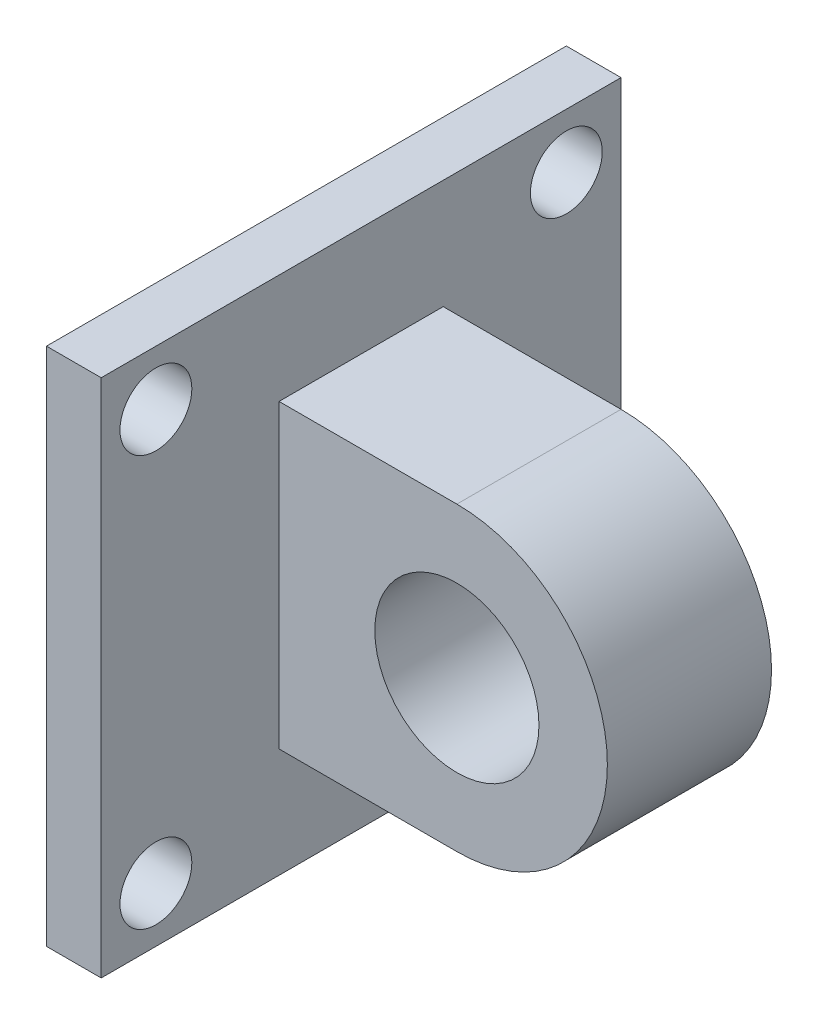
ISO-10303-21;
HEADER;
FILE_DESCRIPTION(('STEP AP214'),'2;1');
FILE_NAME('part.step','',(''),(''),'','','');
FILE_SCHEMA(('AUTOMOTIVE_DESIGN { 1 0 10303 214 1 1 1 1 }'));
ENDSEC;
DATA;
#1=APPLICATION_CONTEXT('core data for automotive mechanical design processes');
#2=APPLICATION_PROTOCOL_DEFINITION('international standard','automotive_design',2000,#1);
#3=PRODUCT_CONTEXT('',#1,'mechanical');
#4=PRODUCT('Part','Part','',(#3));
#5=PRODUCT_RELATED_PRODUCT_CATEGORY('part','',(#4));
#6=PRODUCT_DEFINITION_FORMATION('','',#4);
#7=PRODUCT_DEFINITION_CONTEXT('part definition',#1,'design');
#8=PRODUCT_DEFINITION('design','',#6,#7);
#9=PRODUCT_DEFINITION_SHAPE('','',#8);
#10=(LENGTH_UNIT() NAMED_UNIT(*) SI_UNIT(.MILLI.,.METRE.));
#11=(NAMED_UNIT(*) PLANE_ANGLE_UNIT() SI_UNIT($,.RADIAN.));
#12=(NAMED_UNIT(*) SI_UNIT($,.STERADIAN.) SOLID_ANGLE_UNIT());
#13=UNCERTAINTY_MEASURE_WITH_UNIT(LENGTH_MEASURE(1.E-05),#10,'distance_accuracy_value','');
#14=(GEOMETRIC_REPRESENTATION_CONTEXT(3) GLOBAL_UNCERTAINTY_ASSIGNED_CONTEXT((#13)) GLOBAL_UNIT_ASSIGNED_CONTEXT((#10,
#11,#12)) REPRESENTATION_CONTEXT('',''));
#15=CARTESIAN_POINT('',(0.,0.,0.));
#16=DIRECTION('',(0.,0.,1.));
#17=DIRECTION('',(1.,0.,0.));
#18=AXIS2_PLACEMENT_3D('',#15,#16,#17);
#19=CARTESIAN_POINT('',(25.4,0.,0.));
#20=DIRECTION('',(1.,0.,0.));
#21=DIRECTION('',(0.,0.,-1.));
#22=AXIS2_PLACEMENT_3D('',#19,#20,#21);
#23=PLANE('',#22);
#24=CARTESIAN_POINT('',(25.4,-95.25,-95.25));
#25=DIRECTION('',(1.,0.,0.));
#26=DIRECTION('',(0.,0.,-1.));
#27=AXIS2_PLACEMENT_3D('',#24,#25,#26);
#28=CIRCLE('',#27,16.6751);
#29=CARTESIAN_POINT('',(25.4,-95.25,-111.9251));
#30=VERTEX_POINT('',#29);
#31=EDGE_CURVE('E251',#30,#30,#28,.T.);
#32=ORIENTED_EDGE('',*,*,#31,.F.);
#33=EDGE_LOOP('',(#32));
#34=FACE_BOUND('',#33,.T.);
#35=CARTESIAN_POINT('',(25.4,95.25,-95.25));
#36=DIRECTION('',(1.,0.,0.));
#37=DIRECTION('',(0.,0.,-1.));
#38=AXIS2_PLACEMENT_3D('',#35,#36,#37);
#39=CIRCLE('',#38,16.6751);
#40=CARTESIAN_POINT('',(25.4,95.25,-111.9251));
#41=VERTEX_POINT('',#40);
#42=EDGE_CURVE('E45',#41,#41,#39,.T.);
#43=ORIENTED_EDGE('',*,*,#42,.F.);
#44=EDGE_LOOP('',(#43));
#45=FACE_BOUND('',#44,.T.);
#46=CARTESIAN_POINT('',(25.4,-95.25,95.25));
#47=DIRECTION('',(1.,0.,0.));
#48=DIRECTION('',(0.,0.,-1.));
#49=AXIS2_PLACEMENT_3D('',#46,#47,#48);
#50=CIRCLE('',#49,16.6751);
#51=CARTESIAN_POINT('',(25.4,-95.25,78.5749));
#52=VERTEX_POINT('',#51);
#53=EDGE_CURVE('E180',#52,#52,#50,.T.);
#54=ORIENTED_EDGE('',*,*,#53,.F.);
#55=EDGE_LOOP('',(#54));
#56=FACE_BOUND('',#55,.T.);
#57=CARTESIAN_POINT('',(25.4,95.25,95.25));
#58=DIRECTION('',(1.,0.,0.));
#59=DIRECTION('',(0.,0.,-1.));
#60=AXIS2_PLACEMENT_3D('',#57,#58,#59);
#61=CIRCLE('',#60,16.6751);
#62=CARTESIAN_POINT('',(25.4,95.25,78.5749));
#63=VERTEX_POINT('',#62);
#64=EDGE_CURVE('E171',#63,#63,#61,.T.);
#65=ORIENTED_EDGE('',*,*,#64,.F.);
#66=EDGE_LOOP('',(#65));
#67=FACE_BOUND('',#66,.T.);
#68=DIRECTION('',(0.,0.,1.));
#69=VECTOR('',#68,1.);
#70=CARTESIAN_POINT('',(25.4,120.65,-120.65));
#71=LINE('',#70,#69);
#72=CARTESIAN_POINT('',(25.4,120.65,-120.65));
#73=VERTEX_POINT('',#72);
#74=CARTESIAN_POINT('',(25.4,120.65,120.65));
#75=VERTEX_POINT('',#74);
#76=EDGE_CURVE('E141',#73,#75,#71,.T.);
#77=ORIENTED_EDGE('',*,*,#76,.T.);
#78=DIRECTION('',(0.,-1.,0.));
#79=VECTOR('',#78,1.);
#80=CARTESIAN_POINT('',(25.4,120.65,120.65));
#81=LINE('',#80,#79);
#82=CARTESIAN_POINT('',(25.4,-120.65,120.65));
#83=VERTEX_POINT('',#82);
#84=EDGE_CURVE('E160',#75,#83,#81,.T.);
#85=ORIENTED_EDGE('',*,*,#84,.T.);
#86=DIRECTION('',(0.,0.,-1.));
#87=VECTOR('',#86,1.);
#88=CARTESIAN_POINT('',(25.4,-120.65,120.65));
#89=LINE('',#88,#87);
#90=CARTESIAN_POINT('',(25.4,-120.65,-120.65));
#91=VERTEX_POINT('',#90);
#92=EDGE_CURVE('E163',#83,#91,#89,.T.);
#93=ORIENTED_EDGE('',*,*,#92,.T.);
#94=DIRECTION('',(0.,1.,0.));
#95=VECTOR('',#94,1.);
#96=CARTESIAN_POINT('',(25.4,-120.65,-120.65));
#97=LINE('',#96,#95);
#98=EDGE_CURVE('E148',#91,#73,#97,.T.);
#99=ORIENTED_EDGE('',*,*,#98,.T.);
#100=EDGE_LOOP('',(#77,#85,#93,#99));
#101=FACE_BOUND('',#100,.T.);
#102=DIRECTION('',(0.,0.,1.));
#103=VECTOR('',#102,1.);
#104=CARTESIAN_POINT('',(25.4,69.85,-38.1));
#105=LINE('',#104,#103);
#106=CARTESIAN_POINT('',(25.4,69.85,-38.1));
#107=VERTEX_POINT('',#106);
#108=CARTESIAN_POINT('',(25.4,69.85,38.1));
#109=VERTEX_POINT('',#108);
#110=EDGE_CURVE('E58',#107,#109,#105,.T.);
#111=ORIENTED_EDGE('',*,*,#110,.F.);
#112=DIRECTION('',(0.,-1.,0.));
#113=VECTOR('',#112,1.);
#114=CARTESIAN_POINT('',(25.4,69.85,-38.1));
#115=LINE('',#114,#113);
#116=CARTESIAN_POINT('',(25.4,-69.85,-38.1));
#117=VERTEX_POINT('',#116);
#118=EDGE_CURVE('E62',#107,#117,#115,.T.);
#119=ORIENTED_EDGE('',*,*,#118,.T.);
#120=DIRECTION('',(0.,0.,1.));
#121=VECTOR('',#120,1.);
#122=CARTESIAN_POINT('',(25.4,-69.85,-38.1));
#123=LINE('',#122,#121);
#124=CARTESIAN_POINT('',(25.4,-69.85,38.1));
#125=VERTEX_POINT('',#124);
#126=EDGE_CURVE('E116',#117,#125,#123,.T.);
#127=ORIENTED_EDGE('',*,*,#126,.T.);
#128=DIRECTION('',(0.,-1.,0.));
#129=VECTOR('',#128,1.);
#130=CARTESIAN_POINT('',(25.4,69.85,38.1));
#131=LINE('',#130,#129);
#132=EDGE_CURVE('E134',#109,#125,#131,.T.);
#133=ORIENTED_EDGE('',*,*,#132,.F.);
#134=EDGE_LOOP('',(#111,#119,#127,#133));
#135=FACE_BOUND('',#134,.T.);
#136=ADVANCED_FACE('F41',(#34,#45,#56,#67,#101,#135),#23,.T.);
#137=CARTESIAN_POINT('',(0.,120.65,-120.65));
#138=DIRECTION('',(0.,1.,0.));
#139=DIRECTION('',(0.,0.,1.));
#140=AXIS2_PLACEMENT_3D('',#137,#138,#139);
#141=PLANE('',#140);
#142=ORIENTED_EDGE('',*,*,#76,.F.);
#143=DIRECTION('',(1.,0.,0.));
#144=VECTOR('',#143,1.);
#145=CARTESIAN_POINT('',(0.,120.65,-120.65));
#146=LINE('',#145,#144);
#147=CARTESIAN_POINT('',(0.,120.65,-120.65));
#148=VERTEX_POINT('',#147);
#149=EDGE_CURVE('E11',#148,#73,#146,.T.);
#150=ORIENTED_EDGE('',*,*,#149,.F.);
#151=DIRECTION('',(0.,0.,1.));
#152=VECTOR('',#151,1.);
#153=CARTESIAN_POINT('',(0.,120.65,-120.65));
#154=LINE('',#153,#152);
#155=CARTESIAN_POINT('',(0.,120.65,120.65));
#156=VERTEX_POINT('',#155);
#157=EDGE_CURVE('E144',#148,#156,#154,.T.);
#158=ORIENTED_EDGE('',*,*,#157,.T.);
#159=DIRECTION('',(1.,0.,0.));
#160=VECTOR('',#159,1.);
#161=CARTESIAN_POINT('',(0.,120.65,120.65));
#162=LINE('',#161,#160);
#163=EDGE_CURVE('E157',#156,#75,#162,.T.);
#164=ORIENTED_EDGE('',*,*,#163,.T.);
#165=EDGE_LOOP('',(#142,#150,#158,#164));
#166=FACE_BOUND('',#165,.T.);
#167=ADVANCED_FACE('F43',(#166),#141,.T.);
#168=CARTESIAN_POINT('',(0.,-120.65,-120.65));
#169=DIRECTION('',(0.,0.,-1.));
#170=DIRECTION('',(-1.,0.,0.));
#171=AXIS2_PLACEMENT_3D('',#168,#169,#170);
#172=PLANE('',#171);
#173=ORIENTED_EDGE('',*,*,#98,.F.);
#174=DIRECTION('',(1.,0.,0.));
#175=VECTOR('',#174,1.);
#176=CARTESIAN_POINT('',(0.,-120.65,-120.65));
#177=LINE('',#176,#175);
#178=CARTESIAN_POINT('',(0.,-120.65,-120.65));
#179=VERTEX_POINT('',#178);
#180=EDGE_CURVE('E50',#179,#91,#177,.T.);
#181=ORIENTED_EDGE('',*,*,#180,.F.);
#182=DIRECTION('',(0.,1.,0.));
#183=VECTOR('',#182,1.);
#184=CARTESIAN_POINT('',(0.,-120.65,-120.65));
#185=LINE('',#184,#183);
#186=EDGE_CURVE('E154',#179,#148,#185,.T.);
#187=ORIENTED_EDGE('',*,*,#186,.T.);
#188=ORIENTED_EDGE('',*,*,#149,.T.);
#189=EDGE_LOOP('',(#173,#181,#187,#188));
#190=FACE_BOUND('',#189,.T.);
#191=ADVANCED_FACE('F202',(#190),#172,.T.);
#192=CARTESIAN_POINT('',(0.,-120.65,120.65));
#193=DIRECTION('',(0.,-1.,0.));
#194=DIRECTION('',(0.,0.,-1.));
#195=AXIS2_PLACEMENT_3D('',#192,#193,#194);
#196=PLANE('',#195);
#197=ORIENTED_EDGE('',*,*,#92,.F.);
#198=DIRECTION('',(1.,0.,0.));
#199=VECTOR('',#198,1.);
#200=CARTESIAN_POINT('',(0.,-120.65,120.65));
#201=LINE('',#200,#199);
#202=CARTESIAN_POINT('',(0.,-120.65,120.65));
#203=VERTEX_POINT('',#202);
#204=EDGE_CURVE('E169',#203,#83,#201,.T.);
#205=ORIENTED_EDGE('',*,*,#204,.F.);
#206=DIRECTION('',(0.,0.,-1.));
#207=VECTOR('',#206,1.);
#208=CARTESIAN_POINT('',(0.,-120.65,120.65));
#209=LINE('',#208,#207);
#210=EDGE_CURVE('E151',#203,#179,#209,.T.);
#211=ORIENTED_EDGE('',*,*,#210,.T.);
#212=ORIENTED_EDGE('',*,*,#180,.T.);
#213=EDGE_LOOP('',(#197,#205,#211,#212));
#214=FACE_BOUND('',#213,.T.);
#215=ADVANCED_FACE('F212',(#214),#196,.T.);
#216=CARTESIAN_POINT('',(0.,120.65,120.65));
#217=DIRECTION('',(0.,0.,1.));
#218=DIRECTION('',(1.,0.,0.));
#219=AXIS2_PLACEMENT_3D('',#216,#217,#218);
#220=PLANE('',#219);
#221=ORIENTED_EDGE('',*,*,#84,.F.);
#222=ORIENTED_EDGE('',*,*,#163,.F.);
#223=DIRECTION('',(0.,-1.,0.));
#224=VECTOR('',#223,1.);
#225=CARTESIAN_POINT('',(0.,120.65,120.65));
#226=LINE('',#225,#224);
#227=EDGE_CURVE('E147',#156,#203,#226,.T.);
#228=ORIENTED_EDGE('',*,*,#227,.T.);
#229=ORIENTED_EDGE('',*,*,#204,.T.);
#230=EDGE_LOOP('',(#221,#222,#228,#229));
#231=FACE_BOUND('',#230,.T.);
#232=ADVANCED_FACE('F215',(#231),#220,.T.);
#233=CARTESIAN_POINT('',(0.,0.,0.));
#234=DIRECTION('',(1.,0.,0.));
#235=DIRECTION('',(0.,0.,-1.));
#236=AXIS2_PLACEMENT_3D('',#233,#234,#235);
#237=PLANE('',#236);
#238=CARTESIAN_POINT('',(0.,-95.25,-95.25));
#239=DIRECTION('',(-1.,0.,0.));
#240=DIRECTION('',(0.,0.,1.));
#241=AXIS2_PLACEMENT_3D('',#238,#239,#240);
#242=CIRCLE('',#241,16.6751);
#243=CARTESIAN_POINT('',(0.,-95.25,-78.5749));
#244=VERTEX_POINT('',#243);
#245=EDGE_CURVE('E239',#244,#244,#242,.T.);
#246=ORIENTED_EDGE('',*,*,#245,.F.);
#247=EDGE_LOOP('',(#246));
#248=FACE_BOUND('',#247,.T.);
#249=CARTESIAN_POINT('',(0.,95.25,-95.25));
#250=DIRECTION('',(-1.,0.,0.));
#251=DIRECTION('',(0.,0.,1.));
#252=AXIS2_PLACEMENT_3D('',#249,#250,#251);
#253=CIRCLE('',#252,16.6751);
#254=CARTESIAN_POINT('',(0.,95.25,-78.5749));
#255=VERTEX_POINT('',#254);
#256=EDGE_CURVE('E243',#255,#255,#253,.T.);
#257=ORIENTED_EDGE('',*,*,#256,.F.);
#258=EDGE_LOOP('',(#257));
#259=FACE_BOUND('',#258,.T.);
#260=CARTESIAN_POINT('',(0.,-95.25,95.25));
#261=DIRECTION('',(-1.,0.,0.));
#262=DIRECTION('',(0.,0.,1.));
#263=AXIS2_PLACEMENT_3D('',#260,#261,#262);
#264=CIRCLE('',#263,16.6751);
#265=CARTESIAN_POINT('',(0.,-95.25,111.9251));
#266=VERTEX_POINT('',#265);
#267=EDGE_CURVE('E185',#266,#266,#264,.T.);
#268=ORIENTED_EDGE('',*,*,#267,.F.);
#269=EDGE_LOOP('',(#268));
#270=FACE_BOUND('',#269,.T.);
#271=CARTESIAN_POINT('',(0.,95.25,95.25));
#272=DIRECTION('',(-1.,0.,0.));
#273=DIRECTION('',(0.,0.,1.));
#274=AXIS2_PLACEMENT_3D('',#271,#272,#273);
#275=CIRCLE('',#274,16.6751);
#276=CARTESIAN_POINT('',(0.,95.25,111.9251));
#277=VERTEX_POINT('',#276);
#278=EDGE_CURVE('E174',#277,#277,#275,.T.);
#279=ORIENTED_EDGE('',*,*,#278,.F.);
#280=EDGE_LOOP('',(#279));
#281=FACE_BOUND('',#280,.T.);
#282=ORIENTED_EDGE('',*,*,#157,.F.);
#283=ORIENTED_EDGE('',*,*,#186,.F.);
#284=ORIENTED_EDGE('',*,*,#210,.F.);
#285=ORIENTED_EDGE('',*,*,#227,.F.);
#286=EDGE_LOOP('',(#282,#283,#284,#285));
#287=FACE_BOUND('',#286,.T.);
#288=ADVANCED_FACE('F208',(#248,#259,#270,#281,#287),#237,.F.);
#289=CARTESIAN_POINT('',(107.95,69.85,-38.1));
#290=DIRECTION('',(0.,1.,0.));
#291=DIRECTION('',(0.,0.,1.));
#292=AXIS2_PLACEMENT_3D('',#289,#290,#291);
#293=PLANE('',#292);
#294=DIRECTION('',(-1.,0.,0.));
#295=VECTOR('',#294,1.);
#296=CARTESIAN_POINT('',(107.95,69.85,38.1));
#297=LINE('',#296,#295);
#298=CARTESIAN_POINT('',(107.95,69.85,38.1));
#299=VERTEX_POINT('',#298);
#300=EDGE_CURVE('E131',#299,#109,#297,.T.);
#301=ORIENTED_EDGE('',*,*,#300,.F.);
#302=DIRECTION('',(0.,0.,1.));
#303=VECTOR('',#302,1.);
#304=CARTESIAN_POINT('',(107.95,69.85,-38.1));
#305=LINE('',#304,#303);
#306=CARTESIAN_POINT('',(107.95,69.85,-38.1));
#307=VERTEX_POINT('',#306);
#308=EDGE_CURVE('E115',#307,#299,#305,.T.);
#309=ORIENTED_EDGE('',*,*,#308,.F.);
#310=DIRECTION('',(-1.,0.,0.));
#311=VECTOR('',#310,1.);
#312=CARTESIAN_POINT('',(107.95,69.85,-38.1));
#313=LINE('',#312,#311);
#314=EDGE_CURVE('E126',#307,#107,#313,.T.);
#315=ORIENTED_EDGE('',*,*,#314,.T.);
#316=ORIENTED_EDGE('',*,*,#110,.T.);
#317=EDGE_LOOP('',(#301,#309,#315,#316));
#318=FACE_BOUND('',#317,.T.);
#319=ADVANCED_FACE('F193',(#318),#293,.T.);
#320=CARTESIAN_POINT('',(107.95,0.,-38.1));
#321=DIRECTION('',(0.,0.,1.));
#322=DIRECTION('',(1.,0.,0.));
#323=AXIS2_PLACEMENT_3D('',#320,#321,#322);
#324=CYLINDRICAL_SURFACE('',#323,69.85);
#325=CARTESIAN_POINT('',(107.95,0.,38.1));
#326=DIRECTION('',(0.,0.,1.));
#327=DIRECTION('',(1.,0.,0.));
#328=AXIS2_PLACEMENT_3D('',#325,#326,#327);
#329=CIRCLE('',#328,69.85);
#330=CARTESIAN_POINT('',(107.95,-69.85,38.1));
#331=VERTEX_POINT('',#330);
#332=EDGE_CURVE('E111',#331,#299,#329,.T.);
#333=ORIENTED_EDGE('',*,*,#332,.F.);
#334=DIRECTION('',(0.,0.,1.));
#335=VECTOR('',#334,1.);
#336=CARTESIAN_POINT('',(107.95,-69.85,-38.1));
#337=LINE('',#336,#335);
#338=CARTESIAN_POINT('',(107.95,-69.85,-38.1));
#339=VERTEX_POINT('',#338);
#340=EDGE_CURVE('E105',#339,#331,#337,.T.);
#341=ORIENTED_EDGE('',*,*,#340,.F.);
#342=CARTESIAN_POINT('',(107.95,0.,-38.1));
#343=DIRECTION('',(0.,0.,1.));
#344=DIRECTION('',(1.,0.,0.));
#345=AXIS2_PLACEMENT_3D('',#342,#343,#344);
#346=CIRCLE('',#345,69.85);
#347=EDGE_CURVE('E109',#339,#307,#346,.T.);
#348=ORIENTED_EDGE('',*,*,#347,.T.);
#349=ORIENTED_EDGE('',*,*,#308,.T.);
#350=EDGE_LOOP('',(#333,#341,#348,#349));
#351=FACE_BOUND('',#350,.T.);
#352=ADVANCED_FACE('F107',(#351),#324,.T.);
#353=CARTESIAN_POINT('',(25.4,-69.85,-38.1));
#354=DIRECTION('',(0.,-1.,0.));
#355=DIRECTION('',(0.,0.,-1.));
#356=AXIS2_PLACEMENT_3D('',#353,#354,#355);
#357=PLANE('',#356);
#358=DIRECTION('',(1.,0.,0.));
#359=VECTOR('',#358,1.);
#360=CARTESIAN_POINT('',(25.4,-69.85,38.1));
#361=LINE('',#360,#359);
#362=EDGE_CURVE('E138',#125,#331,#361,.T.);
#363=ORIENTED_EDGE('',*,*,#362,.F.);
#364=ORIENTED_EDGE('',*,*,#126,.F.);
#365=DIRECTION('',(1.,0.,0.));
#366=VECTOR('',#365,1.);
#367=CARTESIAN_POINT('',(25.4,-69.85,-38.1));
#368=LINE('',#367,#366);
#369=EDGE_CURVE('E119',#117,#339,#368,.T.);
#370=ORIENTED_EDGE('',*,*,#369,.T.);
#371=ORIENTED_EDGE('',*,*,#340,.T.);
#372=EDGE_LOOP('',(#363,#364,#370,#371));
#373=FACE_BOUND('',#372,.T.);
#374=ADVANCED_FACE('F120',(#373),#357,.T.);
#375=CARTESIAN_POINT('',(107.95,0.,-38.1));
#376=DIRECTION('',(0.,0.,1.));
#377=DIRECTION('',(1.,0.,0.));
#378=AXIS2_PLACEMENT_3D('',#375,#376,#377);
#379=PLANE('',#378);
#380=CARTESIAN_POINT('',(107.95,0.,-38.1));
#381=DIRECTION('',(0.,0.,-1.));
#382=DIRECTION('',(-1.,0.,0.));
#383=AXIS2_PLACEMENT_3D('',#380,#381,#382);
#384=CIRCLE('',#383,38.1);
#385=CARTESIAN_POINT('',(69.85,0.,-38.1));
#386=VERTEX_POINT('',#385);
#387=EDGE_CURVE('E173',#386,#386,#384,.T.);
#388=ORIENTED_EDGE('',*,*,#387,.F.);
#389=EDGE_LOOP('',(#388));
#390=FACE_BOUND('',#389,.T.);
#391=ORIENTED_EDGE('',*,*,#314,.F.);
#392=ORIENTED_EDGE('',*,*,#347,.F.);
#393=ORIENTED_EDGE('',*,*,#369,.F.);
#394=ORIENTED_EDGE('',*,*,#118,.F.);
#395=EDGE_LOOP('',(#391,#392,#393,#394));
#396=FACE_BOUND('',#395,.T.);
#397=ADVANCED_FACE('F124',(#390,#396),#379,.F.);
#398=CARTESIAN_POINT('',(107.95,0.,38.1));
#399=DIRECTION('',(0.,0.,1.));
#400=DIRECTION('',(1.,0.,0.));
#401=AXIS2_PLACEMENT_3D('',#398,#399,#400);
#402=PLANE('',#401);
#403=CARTESIAN_POINT('',(107.95,0.,38.1));
#404=DIRECTION('',(0.,0.,1.));
#405=DIRECTION('',(1.,0.,0.));
#406=AXIS2_PLACEMENT_3D('',#403,#404,#405);
#407=CIRCLE('',#406,38.1);
#408=CARTESIAN_POINT('',(146.05,0.,38.1));
#409=VERTEX_POINT('',#408);
#410=EDGE_CURVE('E135',#409,#409,#407,.T.);
#411=ORIENTED_EDGE('',*,*,#410,.F.);
#412=EDGE_LOOP('',(#411));
#413=FACE_BOUND('',#412,.T.);
#414=ORIENTED_EDGE('',*,*,#300,.T.);
#415=ORIENTED_EDGE('',*,*,#132,.T.);
#416=ORIENTED_EDGE('',*,*,#362,.T.);
#417=ORIENTED_EDGE('',*,*,#332,.T.);
#418=EDGE_LOOP('',(#414,#415,#416,#417));
#419=FACE_BOUND('',#418,.T.);
#420=ADVANCED_FACE('F195',(#413,#419),#402,.T.);
#421=CARTESIAN_POINT('',(107.95,0.,-38.1));
#422=DIRECTION('',(0.,0.,-1.));
#423=DIRECTION('',(-1.,0.,0.));
#424=AXIS2_PLACEMENT_3D('',#421,#422,#423);
#425=CYLINDRICAL_SURFACE('',#424,38.1);
#426=ORIENTED_EDGE('',*,*,#410,.T.);
#427=EDGE_LOOP('',(#426));
#428=FACE_BOUND('',#427,.T.);
#429=ORIENTED_EDGE('',*,*,#387,.T.);
#430=EDGE_LOOP('',(#429));
#431=FACE_BOUND('',#430,.T.);
#432=ADVANCED_FACE('F273',(#428,#431),#425,.F.);
#433=CARTESIAN_POINT('',(0.,95.25,95.25));
#434=DIRECTION('',(-1.,0.,0.));
#435=DIRECTION('',(0.,0.,1.));
#436=AXIS2_PLACEMENT_3D('',#433,#434,#435);
#437=CYLINDRICAL_SURFACE('',#436,16.6751);
#438=ORIENTED_EDGE('',*,*,#64,.T.);
#439=EDGE_LOOP('',(#438));
#440=FACE_BOUND('',#439,.T.);
#441=ORIENTED_EDGE('',*,*,#278,.T.);
#442=EDGE_LOOP('',(#441));
#443=FACE_BOUND('',#442,.T.);
#444=ADVANCED_FACE('F269',(#440,#443),#437,.F.);
#445=CARTESIAN_POINT('',(0.,-95.25,95.25));
#446=DIRECTION('',(-1.,0.,0.));
#447=DIRECTION('',(0.,0.,1.));
#448=AXIS2_PLACEMENT_3D('',#445,#446,#447);
#449=CYLINDRICAL_SURFACE('',#448,16.6751);
#450=ORIENTED_EDGE('',*,*,#53,.T.);
#451=EDGE_LOOP('',(#450));
#452=FACE_BOUND('',#451,.T.);
#453=ORIENTED_EDGE('',*,*,#267,.T.);
#454=EDGE_LOOP('',(#453));
#455=FACE_BOUND('',#454,.T.);
#456=ADVANCED_FACE('F263',(#452,#455),#449,.F.);
#457=CARTESIAN_POINT('',(0.,95.25,-95.25));
#458=DIRECTION('',(-1.,0.,0.));
#459=DIRECTION('',(0.,0.,1.));
#460=AXIS2_PLACEMENT_3D('',#457,#458,#459);
#461=CYLINDRICAL_SURFACE('',#460,16.6751);
#462=ORIENTED_EDGE('',*,*,#42,.T.);
#463=EDGE_LOOP('',(#462));
#464=FACE_BOUND('',#463,.T.);
#465=ORIENTED_EDGE('',*,*,#256,.T.);
#466=EDGE_LOOP('',(#465));
#467=FACE_BOUND('',#466,.T.);
#468=ADVANCED_FACE('F257',(#464,#467),#461,.F.);
#469=CARTESIAN_POINT('',(0.,-95.25,-95.25));
#470=DIRECTION('',(-1.,0.,0.));
#471=DIRECTION('',(0.,0.,1.));
#472=AXIS2_PLACEMENT_3D('',#469,#470,#471);
#473=CYLINDRICAL_SURFACE('',#472,16.6751);
#474=ORIENTED_EDGE('',*,*,#31,.T.);
#475=EDGE_LOOP('',(#474));
#476=FACE_BOUND('',#475,.T.);
#477=ORIENTED_EDGE('',*,*,#245,.T.);
#478=EDGE_LOOP('',(#477));
#479=FACE_BOUND('',#478,.T.);
#480=ADVANCED_FACE('F255',(#476,#479),#473,.F.);
#481=CLOSED_SHELL('',(#136,#167,#191,#215,#232,#288,#319,#352,#374,#397,#420,#432,#444,#456,
#468,#480));
#482=MANIFOLD_SOLID_BREP('B2',#481);
#483=ADVANCED_BREP_SHAPE_REPRESENTATION('',(#18,#482),#14);
#484=SHAPE_DEFINITION_REPRESENTATION(#9,#483);
ENDSEC;
END-ISO-10303-21;
